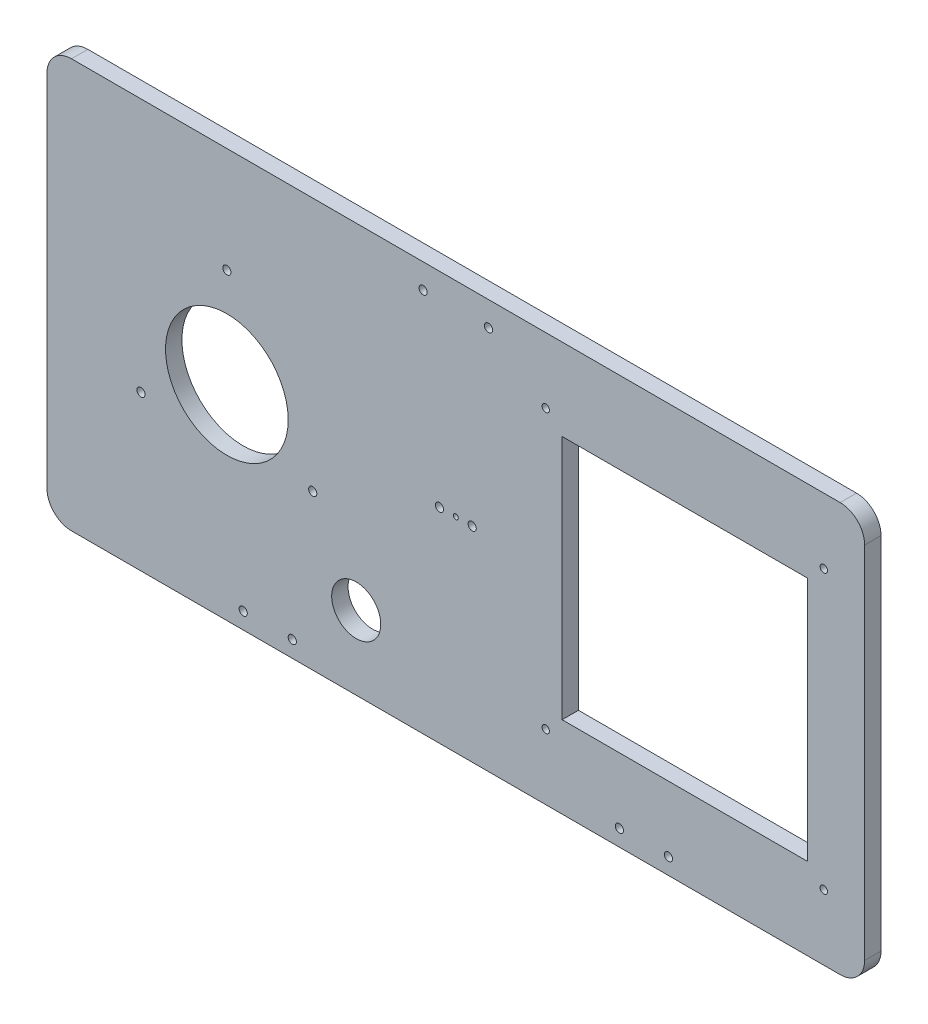
ISO-10303-21;
HEADER;
FILE_DESCRIPTION(('STEP AP214'),'2;1');
FILE_NAME('part.step','',(''),(''),'','','');
FILE_SCHEMA(('AUTOMOTIVE_DESIGN { 1 0 10303 214 1 1 1 1 }'));
ENDSEC;
DATA;
#1=APPLICATION_CONTEXT('core data for automotive mechanical design processes');
#2=APPLICATION_PROTOCOL_DEFINITION('international standard','automotive_design',2000,#1);
#3=PRODUCT_CONTEXT('',#1,'mechanical');
#4=PRODUCT('Part','Part','',(#3));
#5=PRODUCT_RELATED_PRODUCT_CATEGORY('part','',(#4));
#6=PRODUCT_DEFINITION_FORMATION('','',#4);
#7=PRODUCT_DEFINITION_CONTEXT('part definition',#1,'design');
#8=PRODUCT_DEFINITION('design','',#6,#7);
#9=PRODUCT_DEFINITION_SHAPE('','',#8);
#10=(LENGTH_UNIT() NAMED_UNIT(*) SI_UNIT(.MILLI.,.METRE.));
#11=(NAMED_UNIT(*) PLANE_ANGLE_UNIT() SI_UNIT($,.RADIAN.));
#12=(NAMED_UNIT(*) SI_UNIT($,.STERADIAN.) SOLID_ANGLE_UNIT());
#13=UNCERTAINTY_MEASURE_WITH_UNIT(LENGTH_MEASURE(1.E-05),#10,'distance_accuracy_value','');
#14=(GEOMETRIC_REPRESENTATION_CONTEXT(3) GLOBAL_UNCERTAINTY_ASSIGNED_CONTEXT((#13)) GLOBAL_UNIT_ASSIGNED_CONTEXT((#10,
#11,#12)) REPRESENTATION_CONTEXT('',''));
#15=CARTESIAN_POINT('',(0.,0.,0.));
#16=DIRECTION('',(0.,0.,1.));
#17=DIRECTION('',(1.,0.,0.));
#18=AXIS2_PLACEMENT_3D('',#15,#16,#17);
#19=CARTESIAN_POINT('',(485.,235.,10.));
#20=DIRECTION('',(0.,0.,-1.));
#21=DIRECTION('',(-1.,0.,0.));
#22=AXIS2_PLACEMENT_3D('',#19,#20,#21);
#23=PLANE('',#22);
#24=CARTESIAN_POINT('',(485.,235.,10.));
#25=DIRECTION('',(0.,0.,1.));
#26=DIRECTION('',(-1.,0.,0.));
#27=AXIS2_PLACEMENT_3D('',#24,#25,#26);
#28=CIRCLE('',#27,15.);
#29=CARTESIAN_POINT('',(500.,235.,10.));
#30=VERTEX_POINT('',#29);
#31=CARTESIAN_POINT('',(485.,250.,10.));
#32=VERTEX_POINT('',#31);
#33=EDGE_CURVE('E160',#30,#32,#28,.T.);
#34=ORIENTED_EDGE('',*,*,#33,.T.);
#35=DIRECTION('',(-1.,0.,0.));
#36=VECTOR('',#35,1.);
#37=CARTESIAN_POINT('',(15.,250.,10.));
#38=LINE('',#37,#36);
#39=CARTESIAN_POINT('',(15.,250.,10.));
#40=VERTEX_POINT('',#39);
#41=EDGE_CURVE('E163',#32,#40,#38,.T.);
#42=ORIENTED_EDGE('',*,*,#41,.T.);
#43=CARTESIAN_POINT('',(15.,235.,10.));
#44=DIRECTION('',(0.,0.,1.));
#45=DIRECTION('',(-1.,0.,0.));
#46=AXIS2_PLACEMENT_3D('',#43,#44,#45);
#47=CIRCLE('',#46,15.);
#48=CARTESIAN_POINT('',(0.,235.,10.));
#49=VERTEX_POINT('',#48);
#50=EDGE_CURVE('E166',#40,#49,#47,.T.);
#51=ORIENTED_EDGE('',*,*,#50,.T.);
#52=DIRECTION('',(0.,-1.,0.));
#53=VECTOR('',#52,1.);
#54=CARTESIAN_POINT('',(0.,15.0000000000001,10.));
#55=LINE('',#54,#53);
#56=CARTESIAN_POINT('',(0.,15.0000000000001,10.));
#57=VERTEX_POINT('',#56);
#58=EDGE_CURVE('E168',#49,#57,#55,.T.);
#59=ORIENTED_EDGE('',*,*,#58,.T.);
#60=CARTESIAN_POINT('',(15.,15.,10.));
#61=DIRECTION('',(0.,0.,1.));
#62=DIRECTION('',(-1.,0.,0.));
#63=AXIS2_PLACEMENT_3D('',#60,#61,#62);
#64=CIRCLE('',#63,15.);
#65=CARTESIAN_POINT('',(15.0000000000001,0.,10.));
#66=VERTEX_POINT('',#65);
#67=EDGE_CURVE('E170',#57,#66,#64,.T.);
#68=ORIENTED_EDGE('',*,*,#67,.T.);
#69=DIRECTION('',(1.,0.,0.));
#70=VECTOR('',#69,1.);
#71=CARTESIAN_POINT('',(15.0000000000001,0.,10.));
#72=LINE('',#71,#70);
#73=CARTESIAN_POINT('',(485.,0.,10.));
#74=VERTEX_POINT('',#73);
#75=EDGE_CURVE('E172',#66,#74,#72,.T.);
#76=ORIENTED_EDGE('',*,*,#75,.T.);
#77=CARTESIAN_POINT('',(485.,15.,10.));
#78=DIRECTION('',(0.,0.,1.));
#79=DIRECTION('',(1.,0.,0.));
#80=AXIS2_PLACEMENT_3D('',#77,#78,#79);
#81=CIRCLE('',#80,15.);
#82=CARTESIAN_POINT('',(500.,15.,10.));
#83=VERTEX_POINT('',#82);
#84=EDGE_CURVE('E174',#74,#83,#81,.T.);
#85=ORIENTED_EDGE('',*,*,#84,.T.);
#86=DIRECTION('',(0.,1.,0.));
#87=VECTOR('',#86,1.);
#88=CARTESIAN_POINT('',(500.,15.,10.));
#89=LINE('',#88,#87);
#90=EDGE_CURVE('E176',#83,#30,#89,.T.);
#91=ORIENTED_EDGE('',*,*,#90,.T.);
#92=EDGE_LOOP('',(#34,#42,#51,#59,#68,#76,#85,#91));
#93=FACE_BOUND('',#92,.T.);
#94=DIRECTION('',(0.,-1.,0.));
#95=VECTOR('',#94,1.);
#96=CARTESIAN_POINT('',(315.,50.,10.));
#97=LINE('',#96,#95);
#98=CARTESIAN_POINT('',(315.,200.,10.));
#99=VERTEX_POINT('',#98);
#100=CARTESIAN_POINT('',(315.,50.,10.));
#101=VERTEX_POINT('',#100);
#102=EDGE_CURVE('E121',#99,#101,#97,.T.);
#103=ORIENTED_EDGE('',*,*,#102,.F.);
#104=DIRECTION('',(-1.,0.,0.));
#105=VECTOR('',#104,1.);
#106=CARTESIAN_POINT('',(315.,200.,10.));
#107=LINE('',#106,#105);
#108=CARTESIAN_POINT('',(465.,200.,10.));
#109=VERTEX_POINT('',#108);
#110=EDGE_CURVE('E144',#109,#99,#107,.T.);
#111=ORIENTED_EDGE('',*,*,#110,.F.);
#112=DIRECTION('',(0.,1.,0.));
#113=VECTOR('',#112,1.);
#114=CARTESIAN_POINT('',(465.,50.,10.));
#115=LINE('',#114,#113);
#116=CARTESIAN_POINT('',(465.,50.,10.));
#117=VERTEX_POINT('',#116);
#118=EDGE_CURVE('E142',#117,#109,#115,.T.);
#119=ORIENTED_EDGE('',*,*,#118,.F.);
#120=DIRECTION('',(1.,0.,0.));
#121=VECTOR('',#120,1.);
#122=CARTESIAN_POINT('',(315.,50.,10.));
#123=LINE('',#122,#121);
#124=EDGE_CURVE('E129',#101,#117,#123,.T.);
#125=ORIENTED_EDGE('',*,*,#124,.F.);
#126=EDGE_LOOP('',(#103,#111,#119,#125));
#127=FACE_BOUND('',#126,.T.);
#128=CARTESIAN_POINT('',(110.,185.621778264911,10.));
#129=DIRECTION('',(0.,0.,1.));
#130=DIRECTION('',(1.,0.,0.));
#131=AXIS2_PLACEMENT_3D('',#128,#129,#130);
#132=CIRCLE('',#131,2.50000000000001);
#133=CARTESIAN_POINT('',(112.5,185.621778264911,10.));
#134=VERTEX_POINT('',#133);
#135=EDGE_CURVE('E150',#134,#134,#132,.T.);
#136=ORIENTED_EDGE('',*,*,#135,.F.);
#137=EDGE_LOOP('',(#136));
#138=FACE_BOUND('',#137,.T.);
#139=CARTESIAN_POINT('',(57.5000000000001,94.6891108675446,10.));
#140=DIRECTION('',(0.,0.,1.));
#141=DIRECTION('',(1.,0.,0.));
#142=AXIS2_PLACEMENT_3D('',#139,#140,#141);
#143=CIRCLE('',#142,2.5);
#144=CARTESIAN_POINT('',(60.0000000000001,94.6891108675446,10.));
#145=VERTEX_POINT('',#144);
#146=EDGE_CURVE('E462',#145,#145,#143,.T.);
#147=ORIENTED_EDGE('',*,*,#146,.F.);
#148=EDGE_LOOP('',(#147));
#149=FACE_BOUND('',#148,.T.);
#150=CARTESIAN_POINT('',(162.5,94.6891108675446,10.));
#151=DIRECTION('',(0.,0.,1.));
#152=DIRECTION('',(1.,0.,0.));
#153=AXIS2_PLACEMENT_3D('',#150,#151,#152);
#154=CIRCLE('',#153,2.5);
#155=CARTESIAN_POINT('',(165.,94.6891108675446,10.));
#156=VERTEX_POINT('',#155);
#157=EDGE_CURVE('E456',#156,#156,#154,.T.);
#158=ORIENTED_EDGE('',*,*,#157,.F.);
#159=EDGE_LOOP('',(#158));
#160=FACE_BOUND('',#159,.T.);
#161=CARTESIAN_POINT('',(110.,125.,10.));
#162=DIRECTION('',(0.,0.,1.));
#163=DIRECTION('',(1.,0.,0.));
#164=AXIS2_PLACEMENT_3D('',#161,#162,#163);
#165=CIRCLE('',#164,37.5);
#166=CARTESIAN_POINT('',(147.5,125.,10.));
#167=VERTEX_POINT('',#166);
#168=EDGE_CURVE('E450',#167,#167,#165,.T.);
#169=ORIENTED_EDGE('',*,*,#168,.F.);
#170=EDGE_LOOP('',(#169));
#171=FACE_BOUND('',#170,.T.);
#172=CARTESIAN_POINT('',(350.,10.,10.));
#173=DIRECTION('',(0.,0.,1.));
#174=DIRECTION('',(1.,0.,0.));
#175=AXIS2_PLACEMENT_3D('',#172,#173,#174);
#176=CIRCLE('',#175,2.50000000000002);
#177=CARTESIAN_POINT('',(352.5,10.,10.));
#178=VERTEX_POINT('',#177);
#179=EDGE_CURVE('E444',#178,#178,#176,.T.);
#180=ORIENTED_EDGE('',*,*,#179,.F.);
#181=EDGE_LOOP('',(#180));
#182=FACE_BOUND('',#181,.T.);
#183=CARTESIAN_POINT('',(380.,10.,10.));
#184=DIRECTION('',(0.,0.,1.));
#185=DIRECTION('',(1.,0.,0.));
#186=AXIS2_PLACEMENT_3D('',#183,#184,#185);
#187=CIRCLE('',#186,2.50000000000002);
#188=CARTESIAN_POINT('',(382.5,10.,10.));
#189=VERTEX_POINT('',#188);
#190=EDGE_CURVE('E438',#189,#189,#187,.T.);
#191=ORIENTED_EDGE('',*,*,#190,.F.);
#192=EDGE_LOOP('',(#191));
#193=FACE_BOUND('',#192,.T.);
#194=CARTESIAN_POINT('',(120.,10.,10.));
#195=DIRECTION('',(0.,0.,1.));
#196=DIRECTION('',(-1.,0.,0.));
#197=AXIS2_PLACEMENT_3D('',#194,#195,#196);
#198=CIRCLE('',#197,2.5);
#199=CARTESIAN_POINT('',(117.5,10.,10.));
#200=VERTEX_POINT('',#199);
#201=EDGE_CURVE('E432',#200,#200,#198,.T.);
#202=ORIENTED_EDGE('',*,*,#201,.F.);
#203=EDGE_LOOP('',(#202));
#204=FACE_BOUND('',#203,.T.);
#205=CARTESIAN_POINT('',(150.,10.,10.));
#206=DIRECTION('',(0.,0.,1.));
#207=DIRECTION('',(-1.,0.,0.));
#208=AXIS2_PLACEMENT_3D('',#205,#206,#207);
#209=CIRCLE('',#208,2.5);
#210=CARTESIAN_POINT('',(147.5,10.,10.));
#211=VERTEX_POINT('',#210);
#212=EDGE_CURVE('E426',#211,#211,#209,.T.);
#213=ORIENTED_EDGE('',*,*,#212,.F.);
#214=EDGE_LOOP('',(#213));
#215=FACE_BOUND('',#214,.T.);
#216=CARTESIAN_POINT('',(230.,235.,10.));
#217=DIRECTION('',(0.,0.,1.));
#218=DIRECTION('',(1.,0.,0.));
#219=AXIS2_PLACEMENT_3D('',#216,#217,#218);
#220=CIRCLE('',#219,2.5);
#221=CARTESIAN_POINT('',(232.5,235.,10.));
#222=VERTEX_POINT('',#221);
#223=EDGE_CURVE('E420',#222,#222,#220,.T.);
#224=ORIENTED_EDGE('',*,*,#223,.F.);
#225=EDGE_LOOP('',(#224));
#226=FACE_BOUND('',#225,.T.);
#227=CARTESIAN_POINT('',(270.,235.,10.));
#228=DIRECTION('',(0.,0.,1.));
#229=DIRECTION('',(1.,0.,0.));
#230=AXIS2_PLACEMENT_3D('',#227,#228,#229);
#231=CIRCLE('',#230,2.50000000000002);
#232=CARTESIAN_POINT('',(272.5,235.,10.));
#233=VERTEX_POINT('',#232);
#234=EDGE_CURVE('E414',#233,#233,#231,.T.);
#235=ORIENTED_EDGE('',*,*,#234,.F.);
#236=EDGE_LOOP('',(#235));
#237=FACE_BOUND('',#236,.T.);
#238=CARTESIAN_POINT('',(189.096460097782,45.,10.));
#239=DIRECTION('',(0.,0.,1.));
#240=DIRECTION('',(1.,0.,0.));
#241=AXIS2_PLACEMENT_3D('',#238,#239,#240);
#242=CIRCLE('',#241,15.);
#243=CARTESIAN_POINT('',(204.096460097782,45.,10.));
#244=VERTEX_POINT('',#243);
#245=EDGE_CURVE('E408',#244,#244,#242,.T.);
#246=ORIENTED_EDGE('',*,*,#245,.F.);
#247=EDGE_LOOP('',(#246));
#248=FACE_BOUND('',#247,.T.);
#249=CARTESIAN_POINT('',(475.,210.,10.));
#250=DIRECTION('',(0.,0.,1.));
#251=DIRECTION('',(1.,0.,0.));
#252=AXIS2_PLACEMENT_3D('',#249,#250,#251);
#253=CIRCLE('',#252,2.24999999999996);
#254=CARTESIAN_POINT('',(477.25,210.,10.));
#255=VERTEX_POINT('',#254);
#256=EDGE_CURVE('E402',#255,#255,#253,.T.);
#257=ORIENTED_EDGE('',*,*,#256,.F.);
#258=EDGE_LOOP('',(#257));
#259=FACE_BOUND('',#258,.T.);
#260=CARTESIAN_POINT('',(305.,210.,10.));
#261=DIRECTION('',(0.,0.,1.));
#262=DIRECTION('',(1.,0.,0.));
#263=AXIS2_PLACEMENT_3D('',#260,#261,#262);
#264=CIRCLE('',#263,2.24999999999996);
#265=CARTESIAN_POINT('',(307.25,210.,10.));
#266=VERTEX_POINT('',#265);
#267=EDGE_CURVE('E396',#266,#266,#264,.T.);
#268=ORIENTED_EDGE('',*,*,#267,.F.);
#269=EDGE_LOOP('',(#268));
#270=FACE_BOUND('',#269,.T.);
#271=CARTESIAN_POINT('',(305.,40.,10.));
#272=DIRECTION('',(0.,0.,1.));
#273=DIRECTION('',(1.,0.,0.));
#274=AXIS2_PLACEMENT_3D('',#271,#272,#273);
#275=CIRCLE('',#274,2.24999999999995);
#276=CARTESIAN_POINT('',(307.25,40.,10.));
#277=VERTEX_POINT('',#276);
#278=EDGE_CURVE('E390',#277,#277,#275,.T.);
#279=ORIENTED_EDGE('',*,*,#278,.F.);
#280=EDGE_LOOP('',(#279));
#281=FACE_BOUND('',#280,.T.);
#282=CARTESIAN_POINT('',(475.,40.,10.));
#283=DIRECTION('',(0.,0.,1.));
#284=DIRECTION('',(1.,0.,0.));
#285=AXIS2_PLACEMENT_3D('',#282,#283,#284);
#286=CIRCLE('',#285,2.24999999999995);
#287=CARTESIAN_POINT('',(477.25,40.,10.));
#288=VERTEX_POINT('',#287);
#289=EDGE_CURVE('E384',#288,#288,#286,.T.);
#290=ORIENTED_EDGE('',*,*,#289,.F.);
#291=EDGE_LOOP('',(#290));
#292=FACE_BOUND('',#291,.T.);
#293=CARTESIAN_POINT('',(240.,125.,10.));
#294=DIRECTION('',(0.,0.,1.));
#295=DIRECTION('',(1.,0.,0.));
#296=AXIS2_PLACEMENT_3D('',#293,#294,#295);
#297=CIRCLE('',#296,2.5);
#298=CARTESIAN_POINT('',(242.5,125.,10.));
#299=VERTEX_POINT('',#298);
#300=EDGE_CURVE('E378',#299,#299,#297,.T.);
#301=ORIENTED_EDGE('',*,*,#300,.F.);
#302=EDGE_LOOP('',(#301));
#303=FACE_BOUND('',#302,.T.);
#304=CARTESIAN_POINT('',(260.,125.,10.));
#305=DIRECTION('',(0.,0.,1.));
#306=DIRECTION('',(1.,0.,0.));
#307=AXIS2_PLACEMENT_3D('',#304,#305,#306);
#308=CIRCLE('',#307,2.50000000000002);
#309=CARTESIAN_POINT('',(262.5,125.,10.));
#310=VERTEX_POINT('',#309);
#311=EDGE_CURVE('E372',#310,#310,#308,.T.);
#312=ORIENTED_EDGE('',*,*,#311,.F.);
#313=EDGE_LOOP('',(#312));
#314=FACE_BOUND('',#313,.T.);
#315=CARTESIAN_POINT('',(250.,125.,10.));
#316=DIRECTION('',(0.,0.,1.));
#317=DIRECTION('',(1.,0.,0.));
#318=AXIS2_PLACEMENT_3D('',#315,#316,#317);
#319=CIRCLE('',#318,1.50000000000002);
#320=CARTESIAN_POINT('',(251.5,125.,10.));
#321=VERTEX_POINT('',#320);
#322=EDGE_CURVE('E363',#321,#321,#319,.T.);
#323=ORIENTED_EDGE('',*,*,#322,.F.);
#324=EDGE_LOOP('',(#323));
#325=FACE_BOUND('',#324,.T.);
#326=ADVANCED_FACE('F32',(#93,#127,#138,#149,#160,#171,#182,#193,#204,#215,#226,#237,#248,#259,
#270,#281,#292,#303,#314,#325),#23,.F.);
#327=CARTESIAN_POINT('',(485.,235.,0.));
#328=DIRECTION('',(0.,0.,-1.));
#329=DIRECTION('',(-1.,0.,0.));
#330=AXIS2_PLACEMENT_3D('',#327,#328,#329);
#331=PLANE('',#330);
#332=CARTESIAN_POINT('',(260.,125.,0.));
#333=DIRECTION('',(0.,0.,1.));
#334=DIRECTION('',(1.,0.,0.));
#335=AXIS2_PLACEMENT_3D('',#332,#333,#334);
#336=CIRCLE('',#335,2.50000000000002);
#337=CARTESIAN_POINT('',(262.5,125.,0.));
#338=VERTEX_POINT('',#337);
#339=EDGE_CURVE('E369',#338,#338,#336,.T.);
#340=ORIENTED_EDGE('',*,*,#339,.T.);
#341=EDGE_LOOP('',(#340));
#342=FACE_BOUND('',#341,.T.);
#343=CARTESIAN_POINT('',(475.,40.,0.));
#344=DIRECTION('',(0.,0.,1.));
#345=DIRECTION('',(1.,0.,0.));
#346=AXIS2_PLACEMENT_3D('',#343,#344,#345);
#347=CIRCLE('',#346,2.24999999999995);
#348=CARTESIAN_POINT('',(477.25,40.,0.));
#349=VERTEX_POINT('',#348);
#350=EDGE_CURVE('E381',#349,#349,#347,.T.);
#351=ORIENTED_EDGE('',*,*,#350,.T.);
#352=EDGE_LOOP('',(#351));
#353=FACE_BOUND('',#352,.T.);
#354=CARTESIAN_POINT('',(305.,210.,0.));
#355=DIRECTION('',(0.,0.,1.));
#356=DIRECTION('',(1.,0.,0.));
#357=AXIS2_PLACEMENT_3D('',#354,#355,#356);
#358=CIRCLE('',#357,2.24999999999996);
#359=CARTESIAN_POINT('',(307.25,210.,0.));
#360=VERTEX_POINT('',#359);
#361=EDGE_CURVE('E393',#360,#360,#358,.T.);
#362=ORIENTED_EDGE('',*,*,#361,.T.);
#363=EDGE_LOOP('',(#362));
#364=FACE_BOUND('',#363,.T.);
#365=CARTESIAN_POINT('',(189.096460097782,45.,0.));
#366=DIRECTION('',(0.,0.,1.));
#367=DIRECTION('',(1.,0.,0.));
#368=AXIS2_PLACEMENT_3D('',#365,#366,#367);
#369=CIRCLE('',#368,15.);
#370=CARTESIAN_POINT('',(204.096460097782,45.,0.));
#371=VERTEX_POINT('',#370);
#372=EDGE_CURVE('E405',#371,#371,#369,.T.);
#373=ORIENTED_EDGE('',*,*,#372,.T.);
#374=EDGE_LOOP('',(#373));
#375=FACE_BOUND('',#374,.T.);
#376=CARTESIAN_POINT('',(230.,235.,0.));
#377=DIRECTION('',(0.,0.,1.));
#378=DIRECTION('',(1.,0.,0.));
#379=AXIS2_PLACEMENT_3D('',#376,#377,#378);
#380=CIRCLE('',#379,2.5);
#381=CARTESIAN_POINT('',(232.5,235.,0.));
#382=VERTEX_POINT('',#381);
#383=EDGE_CURVE('E417',#382,#382,#380,.T.);
#384=ORIENTED_EDGE('',*,*,#383,.T.);
#385=EDGE_LOOP('',(#384));
#386=FACE_BOUND('',#385,.T.);
#387=CARTESIAN_POINT('',(120.,10.,0.));
#388=DIRECTION('',(0.,0.,1.));
#389=DIRECTION('',(-1.,0.,0.));
#390=AXIS2_PLACEMENT_3D('',#387,#388,#389);
#391=CIRCLE('',#390,2.5);
#392=CARTESIAN_POINT('',(117.5,10.,0.));
#393=VERTEX_POINT('',#392);
#394=EDGE_CURVE('E429',#393,#393,#391,.T.);
#395=ORIENTED_EDGE('',*,*,#394,.T.);
#396=EDGE_LOOP('',(#395));
#397=FACE_BOUND('',#396,.T.);
#398=CARTESIAN_POINT('',(350.,10.,0.));
#399=DIRECTION('',(0.,0.,1.));
#400=DIRECTION('',(1.,0.,0.));
#401=AXIS2_PLACEMENT_3D('',#398,#399,#400);
#402=CIRCLE('',#401,2.50000000000002);
#403=CARTESIAN_POINT('',(352.5,10.,0.));
#404=VERTEX_POINT('',#403);
#405=EDGE_CURVE('E441',#404,#404,#402,.T.);
#406=ORIENTED_EDGE('',*,*,#405,.T.);
#407=EDGE_LOOP('',(#406));
#408=FACE_BOUND('',#407,.T.);
#409=CARTESIAN_POINT('',(162.5,94.6891108675446,0.));
#410=DIRECTION('',(0.,0.,1.));
#411=DIRECTION('',(1.,0.,0.));
#412=AXIS2_PLACEMENT_3D('',#409,#410,#411);
#413=CIRCLE('',#412,2.5);
#414=CARTESIAN_POINT('',(165.,94.6891108675446,0.));
#415=VERTEX_POINT('',#414);
#416=EDGE_CURVE('E453',#415,#415,#413,.T.);
#417=ORIENTED_EDGE('',*,*,#416,.T.);
#418=EDGE_LOOP('',(#417));
#419=FACE_BOUND('',#418,.T.);
#420=CARTESIAN_POINT('',(110.,185.621778264911,0.));
#421=DIRECTION('',(0.,0.,1.));
#422=DIRECTION('',(1.,0.,0.));
#423=AXIS2_PLACEMENT_3D('',#420,#421,#422);
#424=CIRCLE('',#423,2.50000000000001);
#425=CARTESIAN_POINT('',(112.5,185.621778264911,0.));
#426=VERTEX_POINT('',#425);
#427=EDGE_CURVE('E465',#426,#426,#424,.T.);
#428=ORIENTED_EDGE('',*,*,#427,.T.);
#429=EDGE_LOOP('',(#428));
#430=FACE_BOUND('',#429,.T.);
#431=CARTESIAN_POINT('',(485.,235.,0.));
#432=DIRECTION('',(0.,0.,1.));
#433=DIRECTION('',(-1.,0.,0.));
#434=AXIS2_PLACEMENT_3D('',#431,#432,#433);
#435=CIRCLE('',#434,15.);
#436=CARTESIAN_POINT('',(500.,235.,0.));
#437=VERTEX_POINT('',#436);
#438=CARTESIAN_POINT('',(485.,250.,0.));
#439=VERTEX_POINT('',#438);
#440=EDGE_CURVE('E137',#437,#439,#435,.T.);
#441=ORIENTED_EDGE('',*,*,#440,.F.);
#442=DIRECTION('',(0.,1.,0.));
#443=VECTOR('',#442,1.);
#444=CARTESIAN_POINT('',(500.,15.,0.));
#445=LINE('',#444,#443);
#446=CARTESIAN_POINT('',(500.,15.,0.));
#447=VERTEX_POINT('',#446);
#448=EDGE_CURVE('E164',#447,#437,#445,.T.);
#449=ORIENTED_EDGE('',*,*,#448,.F.);
#450=CARTESIAN_POINT('',(485.,15.,0.));
#451=DIRECTION('',(0.,0.,1.));
#452=DIRECTION('',(1.,0.,0.));
#453=AXIS2_PLACEMENT_3D('',#450,#451,#452);
#454=CIRCLE('',#453,15.);
#455=CARTESIAN_POINT('',(485.,0.,0.));
#456=VERTEX_POINT('',#455);
#457=EDGE_CURVE('E191',#456,#447,#454,.T.);
#458=ORIENTED_EDGE('',*,*,#457,.F.);
#459=DIRECTION('',(1.,0.,0.));
#460=VECTOR('',#459,1.);
#461=CARTESIAN_POINT('',(15.0000000000001,0.,0.));
#462=LINE('',#461,#460);
#463=CARTESIAN_POINT('',(15.0000000000001,0.,0.));
#464=VERTEX_POINT('',#463);
#465=EDGE_CURVE('E189',#464,#456,#462,.T.);
#466=ORIENTED_EDGE('',*,*,#465,.F.);
#467=CARTESIAN_POINT('',(15.,15.,0.));
#468=DIRECTION('',(0.,0.,1.));
#469=DIRECTION('',(-1.,0.,0.));
#470=AXIS2_PLACEMENT_3D('',#467,#468,#469);
#471=CIRCLE('',#470,15.);
#472=CARTESIAN_POINT('',(0.,15.0000000000001,0.));
#473=VERTEX_POINT('',#472);
#474=EDGE_CURVE('E187',#473,#464,#471,.T.);
#475=ORIENTED_EDGE('',*,*,#474,.F.);
#476=DIRECTION('',(0.,-1.,0.));
#477=VECTOR('',#476,1.);
#478=CARTESIAN_POINT('',(0.,15.0000000000001,0.));
#479=LINE('',#478,#477);
#480=CARTESIAN_POINT('',(0.,235.,0.));
#481=VERTEX_POINT('',#480);
#482=EDGE_CURVE('E185',#481,#473,#479,.T.);
#483=ORIENTED_EDGE('',*,*,#482,.F.);
#484=CARTESIAN_POINT('',(15.,235.,0.));
#485=DIRECTION('',(0.,0.,1.));
#486=DIRECTION('',(-1.,0.,0.));
#487=AXIS2_PLACEMENT_3D('',#484,#485,#486);
#488=CIRCLE('',#487,15.);
#489=CARTESIAN_POINT('',(15.,250.,0.));
#490=VERTEX_POINT('',#489);
#491=EDGE_CURVE('E183',#490,#481,#488,.T.);
#492=ORIENTED_EDGE('',*,*,#491,.F.);
#493=DIRECTION('',(-1.,0.,0.));
#494=VECTOR('',#493,1.);
#495=CARTESIAN_POINT('',(15.,250.,0.));
#496=LINE('',#495,#494);
#497=EDGE_CURVE('E181',#439,#490,#496,.T.);
#498=ORIENTED_EDGE('',*,*,#497,.F.);
#499=EDGE_LOOP('',(#441,#449,#458,#466,#475,#483,#492,#498));
#500=FACE_BOUND('',#499,.T.);
#501=DIRECTION('',(-1.,0.,0.));
#502=VECTOR('',#501,1.);
#503=CARTESIAN_POINT('',(315.,200.,0.));
#504=LINE('',#503,#502);
#505=CARTESIAN_POINT('',(465.,200.,0.));
#506=VERTEX_POINT('',#505);
#507=CARTESIAN_POINT('',(315.,200.,0.));
#508=VERTEX_POINT('',#507);
#509=EDGE_CURVE('E130',#506,#508,#504,.T.);
#510=ORIENTED_EDGE('',*,*,#509,.T.);
#511=DIRECTION('',(0.,-1.,0.));
#512=VECTOR('',#511,1.);
#513=CARTESIAN_POINT('',(315.,50.,0.));
#514=LINE('',#513,#512);
#515=CARTESIAN_POINT('',(315.,50.,0.));
#516=VERTEX_POINT('',#515);
#517=EDGE_CURVE('E55',#508,#516,#514,.T.);
#518=ORIENTED_EDGE('',*,*,#517,.T.);
#519=DIRECTION('',(1.,0.,0.));
#520=VECTOR('',#519,1.);
#521=CARTESIAN_POINT('',(315.,50.,0.));
#522=LINE('',#521,#520);
#523=CARTESIAN_POINT('',(465.,50.,0.));
#524=VERTEX_POINT('',#523);
#525=EDGE_CURVE('E136',#516,#524,#522,.T.);
#526=ORIENTED_EDGE('',*,*,#525,.T.);
#527=DIRECTION('',(0.,1.,0.));
#528=VECTOR('',#527,1.);
#529=CARTESIAN_POINT('',(465.,50.,0.));
#530=LINE('',#529,#528);
#531=EDGE_CURVE('E152',#524,#506,#530,.T.);
#532=ORIENTED_EDGE('',*,*,#531,.T.);
#533=EDGE_LOOP('',(#510,#518,#526,#532));
#534=FACE_BOUND('',#533,.T.);
#535=CARTESIAN_POINT('',(57.5000000000001,94.6891108675446,0.));
#536=DIRECTION('',(0.,0.,1.));
#537=DIRECTION('',(1.,0.,0.));
#538=AXIS2_PLACEMENT_3D('',#535,#536,#537);
#539=CIRCLE('',#538,2.5);
#540=CARTESIAN_POINT('',(60.0000000000001,94.6891108675446,0.));
#541=VERTEX_POINT('',#540);
#542=EDGE_CURVE('E459',#541,#541,#539,.T.);
#543=ORIENTED_EDGE('',*,*,#542,.T.);
#544=EDGE_LOOP('',(#543));
#545=FACE_BOUND('',#544,.T.);
#546=CARTESIAN_POINT('',(110.,125.,0.));
#547=DIRECTION('',(0.,0.,1.));
#548=DIRECTION('',(1.,0.,0.));
#549=AXIS2_PLACEMENT_3D('',#546,#547,#548);
#550=CIRCLE('',#549,37.5);
#551=CARTESIAN_POINT('',(147.5,125.,0.));
#552=VERTEX_POINT('',#551);
#553=EDGE_CURVE('E447',#552,#552,#550,.T.);
#554=ORIENTED_EDGE('',*,*,#553,.T.);
#555=EDGE_LOOP('',(#554));
#556=FACE_BOUND('',#555,.T.);
#557=CARTESIAN_POINT('',(380.,10.,0.));
#558=DIRECTION('',(0.,0.,1.));
#559=DIRECTION('',(1.,0.,0.));
#560=AXIS2_PLACEMENT_3D('',#557,#558,#559);
#561=CIRCLE('',#560,2.50000000000002);
#562=CARTESIAN_POINT('',(382.5,10.,0.));
#563=VERTEX_POINT('',#562);
#564=EDGE_CURVE('E435',#563,#563,#561,.T.);
#565=ORIENTED_EDGE('',*,*,#564,.T.);
#566=EDGE_LOOP('',(#565));
#567=FACE_BOUND('',#566,.T.);
#568=CARTESIAN_POINT('',(150.,10.,0.));
#569=DIRECTION('',(0.,0.,1.));
#570=DIRECTION('',(-1.,0.,0.));
#571=AXIS2_PLACEMENT_3D('',#568,#569,#570);
#572=CIRCLE('',#571,2.5);
#573=CARTESIAN_POINT('',(147.5,10.,0.));
#574=VERTEX_POINT('',#573);
#575=EDGE_CURVE('E423',#574,#574,#572,.T.);
#576=ORIENTED_EDGE('',*,*,#575,.T.);
#577=EDGE_LOOP('',(#576));
#578=FACE_BOUND('',#577,.T.);
#579=CARTESIAN_POINT('',(270.,235.,0.));
#580=DIRECTION('',(0.,0.,1.));
#581=DIRECTION('',(1.,0.,0.));
#582=AXIS2_PLACEMENT_3D('',#579,#580,#581);
#583=CIRCLE('',#582,2.50000000000002);
#584=CARTESIAN_POINT('',(272.5,235.,0.));
#585=VERTEX_POINT('',#584);
#586=EDGE_CURVE('E411',#585,#585,#583,.T.);
#587=ORIENTED_EDGE('',*,*,#586,.T.);
#588=EDGE_LOOP('',(#587));
#589=FACE_BOUND('',#588,.T.);
#590=CARTESIAN_POINT('',(475.,210.,0.));
#591=DIRECTION('',(0.,0.,1.));
#592=DIRECTION('',(1.,0.,0.));
#593=AXIS2_PLACEMENT_3D('',#590,#591,#592);
#594=CIRCLE('',#593,2.24999999999996);
#595=CARTESIAN_POINT('',(477.25,210.,0.));
#596=VERTEX_POINT('',#595);
#597=EDGE_CURVE('E399',#596,#596,#594,.T.);
#598=ORIENTED_EDGE('',*,*,#597,.T.);
#599=EDGE_LOOP('',(#598));
#600=FACE_BOUND('',#599,.T.);
#601=CARTESIAN_POINT('',(305.,40.,0.));
#602=DIRECTION('',(0.,0.,1.));
#603=DIRECTION('',(1.,0.,0.));
#604=AXIS2_PLACEMENT_3D('',#601,#602,#603);
#605=CIRCLE('',#604,2.24999999999995);
#606=CARTESIAN_POINT('',(307.25,40.,0.));
#607=VERTEX_POINT('',#606);
#608=EDGE_CURVE('E387',#607,#607,#605,.T.);
#609=ORIENTED_EDGE('',*,*,#608,.T.);
#610=EDGE_LOOP('',(#609));
#611=FACE_BOUND('',#610,.T.);
#612=CARTESIAN_POINT('',(240.,125.,0.));
#613=DIRECTION('',(0.,0.,1.));
#614=DIRECTION('',(1.,0.,0.));
#615=AXIS2_PLACEMENT_3D('',#612,#613,#614);
#616=CIRCLE('',#615,2.5);
#617=CARTESIAN_POINT('',(242.5,125.,0.));
#618=VERTEX_POINT('',#617);
#619=EDGE_CURVE('E375',#618,#618,#616,.T.);
#620=ORIENTED_EDGE('',*,*,#619,.T.);
#621=EDGE_LOOP('',(#620));
#622=FACE_BOUND('',#621,.T.);
#623=CARTESIAN_POINT('',(250.,125.,0.));
#624=DIRECTION('',(0.,0.,1.));
#625=DIRECTION('',(1.,0.,0.));
#626=AXIS2_PLACEMENT_3D('',#623,#624,#625);
#627=CIRCLE('',#626,1.50000000000002);
#628=CARTESIAN_POINT('',(251.5,125.,0.));
#629=VERTEX_POINT('',#628);
#630=EDGE_CURVE('E366',#629,#629,#627,.T.);
#631=ORIENTED_EDGE('',*,*,#630,.T.);
#632=EDGE_LOOP('',(#631));
#633=FACE_BOUND('',#632,.T.);
#634=ADVANCED_FACE('F221',(#342,#353,#364,#375,#386,#397,#408,#419,#430,#500,#534,#545,#556,
#567,#578,#589,#600,#611,#622,#633),#331,.T.);
#635=CARTESIAN_POINT('',(485.,235.,10.));
#636=DIRECTION('',(0.,0.,-1.));
#637=DIRECTION('',(-1.,0.,0.));
#638=AXIS2_PLACEMENT_3D('',#635,#636,#637);
#639=CYLINDRICAL_SURFACE('',#638,15.);
#640=ORIENTED_EDGE('',*,*,#440,.T.);
#641=DIRECTION('',(0.,0.,-1.));
#642=VECTOR('',#641,1.);
#643=CARTESIAN_POINT('',(485.,250.,10.));
#644=LINE('',#643,#642);
#645=EDGE_CURVE('E11',#32,#439,#644,.T.);
#646=ORIENTED_EDGE('',*,*,#645,.F.);
#647=ORIENTED_EDGE('',*,*,#33,.F.);
#648=DIRECTION('',(0.,0.,-1.));
#649=VECTOR('',#648,1.);
#650=CARTESIAN_POINT('',(500.,235.,10.));
#651=LINE('',#650,#649);
#652=EDGE_CURVE('E178',#30,#437,#651,.T.);
#653=ORIENTED_EDGE('',*,*,#652,.T.);
#654=EDGE_LOOP('',(#640,#646,#647,#653));
#655=FACE_BOUND('',#654,.T.);
#656=ADVANCED_FACE('F34',(#655),#639,.T.);
#657=CARTESIAN_POINT('',(15.,250.,10.));
#658=DIRECTION('',(0.,-1.,0.));
#659=DIRECTION('',(0.,0.,-1.));
#660=AXIS2_PLACEMENT_3D('',#657,#658,#659);
#661=PLANE('',#660);
#662=ORIENTED_EDGE('',*,*,#497,.T.);
#663=DIRECTION('',(0.,0.,-1.));
#664=VECTOR('',#663,1.);
#665=CARTESIAN_POINT('',(15.,250.,10.));
#666=LINE('',#665,#664);
#667=EDGE_CURVE('E40',#40,#490,#666,.T.);
#668=ORIENTED_EDGE('',*,*,#667,.F.);
#669=ORIENTED_EDGE('',*,*,#41,.F.);
#670=ORIENTED_EDGE('',*,*,#645,.T.);
#671=EDGE_LOOP('',(#662,#668,#669,#670));
#672=FACE_BOUND('',#671,.T.);
#673=ADVANCED_FACE('F238',(#672),#661,.F.);
#674=CARTESIAN_POINT('',(15.,235.,10.));
#675=DIRECTION('',(0.,0.,-1.));
#676=DIRECTION('',(-1.,0.,0.));
#677=AXIS2_PLACEMENT_3D('',#674,#675,#676);
#678=CYLINDRICAL_SURFACE('',#677,15.);
#679=ORIENTED_EDGE('',*,*,#491,.T.);
#680=DIRECTION('',(0.,0.,-1.));
#681=VECTOR('',#680,1.);
#682=CARTESIAN_POINT('',(0.,235.,10.));
#683=LINE('',#682,#681);
#684=EDGE_CURVE('E208',#49,#481,#683,.T.);
#685=ORIENTED_EDGE('',*,*,#684,.F.);
#686=ORIENTED_EDGE('',*,*,#50,.F.);
#687=ORIENTED_EDGE('',*,*,#667,.T.);
#688=EDGE_LOOP('',(#679,#685,#686,#687));
#689=FACE_BOUND('',#688,.T.);
#690=ADVANCED_FACE('F215',(#689),#678,.T.);
#691=CARTESIAN_POINT('',(0.,15.0000000000001,10.));
#692=DIRECTION('',(1.,0.,0.));
#693=DIRECTION('',(0.,0.,-1.));
#694=AXIS2_PLACEMENT_3D('',#691,#692,#693);
#695=PLANE('',#694);
#696=ORIENTED_EDGE('',*,*,#482,.T.);
#697=DIRECTION('',(0.,0.,-1.));
#698=VECTOR('',#697,1.);
#699=CARTESIAN_POINT('',(0.,15.0000000000001,10.));
#700=LINE('',#699,#698);
#701=EDGE_CURVE('E205',#57,#473,#700,.T.);
#702=ORIENTED_EDGE('',*,*,#701,.F.);
#703=ORIENTED_EDGE('',*,*,#58,.F.);
#704=ORIENTED_EDGE('',*,*,#684,.T.);
#705=EDGE_LOOP('',(#696,#702,#703,#704));
#706=FACE_BOUND('',#705,.T.);
#707=ADVANCED_FACE('F227',(#706),#695,.F.);
#708=CARTESIAN_POINT('',(15.,15.,10.));
#709=DIRECTION('',(0.,0.,-1.));
#710=DIRECTION('',(-1.,0.,0.));
#711=AXIS2_PLACEMENT_3D('',#708,#709,#710);
#712=CYLINDRICAL_SURFACE('',#711,15.);
#713=ORIENTED_EDGE('',*,*,#474,.T.);
#714=DIRECTION('',(0.,0.,-1.));
#715=VECTOR('',#714,1.);
#716=CARTESIAN_POINT('',(15.0000000000001,0.,10.));
#717=LINE('',#716,#715);
#718=EDGE_CURVE('E202',#66,#464,#717,.T.);
#719=ORIENTED_EDGE('',*,*,#718,.F.);
#720=ORIENTED_EDGE('',*,*,#67,.F.);
#721=ORIENTED_EDGE('',*,*,#701,.T.);
#722=EDGE_LOOP('',(#713,#719,#720,#721));
#723=FACE_BOUND('',#722,.T.);
#724=ADVANCED_FACE('F231',(#723),#712,.T.);
#725=CARTESIAN_POINT('',(15.0000000000001,0.,10.));
#726=DIRECTION('',(0.,1.,0.));
#727=DIRECTION('',(-1.,0.,0.));
#728=AXIS2_PLACEMENT_3D('',#725,#726,#727);
#729=PLANE('',#728);
#730=ORIENTED_EDGE('',*,*,#465,.T.);
#731=DIRECTION('',(0.,0.,-1.));
#732=VECTOR('',#731,1.);
#733=CARTESIAN_POINT('',(485.,0.,10.));
#734=LINE('',#733,#732);
#735=EDGE_CURVE('E199',#74,#456,#734,.T.);
#736=ORIENTED_EDGE('',*,*,#735,.F.);
#737=ORIENTED_EDGE('',*,*,#75,.F.);
#738=ORIENTED_EDGE('',*,*,#718,.T.);
#739=EDGE_LOOP('',(#730,#736,#737,#738));
#740=FACE_BOUND('',#739,.T.);
#741=ADVANCED_FACE('F251',(#740),#729,.F.);
#742=CARTESIAN_POINT('',(485.,15.,10.));
#743=DIRECTION('',(0.,0.,-1.));
#744=DIRECTION('',(-1.,0.,0.));
#745=AXIS2_PLACEMENT_3D('',#742,#743,#744);
#746=CYLINDRICAL_SURFACE('',#745,15.);
#747=ORIENTED_EDGE('',*,*,#457,.T.);
#748=DIRECTION('',(0.,0.,-1.));
#749=VECTOR('',#748,1.);
#750=CARTESIAN_POINT('',(500.,15.,10.));
#751=LINE('',#750,#749);
#752=EDGE_CURVE('E196',#83,#447,#751,.T.);
#753=ORIENTED_EDGE('',*,*,#752,.F.);
#754=ORIENTED_EDGE('',*,*,#84,.F.);
#755=ORIENTED_EDGE('',*,*,#735,.T.);
#756=EDGE_LOOP('',(#747,#753,#754,#755));
#757=FACE_BOUND('',#756,.T.);
#758=ADVANCED_FACE('F249',(#757),#746,.T.);
#759=CARTESIAN_POINT('',(500.,15.,10.));
#760=DIRECTION('',(-1.,0.,0.));
#761=DIRECTION('',(0.,0.,1.));
#762=AXIS2_PLACEMENT_3D('',#759,#760,#761);
#763=PLANE('',#762);
#764=ORIENTED_EDGE('',*,*,#448,.T.);
#765=ORIENTED_EDGE('',*,*,#652,.F.);
#766=ORIENTED_EDGE('',*,*,#90,.F.);
#767=ORIENTED_EDGE('',*,*,#752,.T.);
#768=EDGE_LOOP('',(#764,#765,#766,#767));
#769=FACE_BOUND('',#768,.T.);
#770=ADVANCED_FACE('F244',(#769),#763,.F.);
#771=CARTESIAN_POINT('',(315.,50.,10.));
#772=DIRECTION('',(1.,0.,0.));
#773=DIRECTION('',(0.,1.,0.));
#774=AXIS2_PLACEMENT_3D('',#771,#772,#773);
#775=PLANE('',#774);
#776=ORIENTED_EDGE('',*,*,#517,.F.);
#777=DIRECTION('',(0.,0.,-1.));
#778=VECTOR('',#777,1.);
#779=CARTESIAN_POINT('',(315.,200.,10.));
#780=LINE('',#779,#778);
#781=EDGE_CURVE('E125',#99,#508,#780,.T.);
#782=ORIENTED_EDGE('',*,*,#781,.F.);
#783=ORIENTED_EDGE('',*,*,#102,.T.);
#784=DIRECTION('',(0.,0.,-1.));
#785=VECTOR('',#784,1.);
#786=CARTESIAN_POINT('',(315.,50.,10.));
#787=LINE('',#786,#785);
#788=EDGE_CURVE('E124',#101,#516,#787,.T.);
#789=ORIENTED_EDGE('',*,*,#788,.T.);
#790=EDGE_LOOP('',(#776,#782,#783,#789));
#791=FACE_BOUND('',#790,.T.);
#792=ADVANCED_FACE('F123',(#791),#775,.T.);
#793=CARTESIAN_POINT('',(315.,50.,10.));
#794=DIRECTION('',(0.,1.,0.));
#795=DIRECTION('',(0.,0.,1.));
#796=AXIS2_PLACEMENT_3D('',#793,#794,#795);
#797=PLANE('',#796);
#798=ORIENTED_EDGE('',*,*,#525,.F.);
#799=ORIENTED_EDGE('',*,*,#788,.F.);
#800=ORIENTED_EDGE('',*,*,#124,.T.);
#801=DIRECTION('',(0.,0.,-1.));
#802=VECTOR('',#801,1.);
#803=CARTESIAN_POINT('',(465.,50.,10.));
#804=LINE('',#803,#802);
#805=EDGE_CURVE('E138',#117,#524,#804,.T.);
#806=ORIENTED_EDGE('',*,*,#805,.T.);
#807=EDGE_LOOP('',(#798,#799,#800,#806));
#808=FACE_BOUND('',#807,.T.);
#809=ADVANCED_FACE('F133',(#808),#797,.T.);
#810=CARTESIAN_POINT('',(465.,50.,10.));
#811=DIRECTION('',(-1.,0.,0.));
#812=DIRECTION('',(0.,-1.,0.));
#813=AXIS2_PLACEMENT_3D('',#810,#811,#812);
#814=PLANE('',#813);
#815=ORIENTED_EDGE('',*,*,#531,.F.);
#816=ORIENTED_EDGE('',*,*,#805,.F.);
#817=ORIENTED_EDGE('',*,*,#118,.T.);
#818=DIRECTION('',(0.,0.,-1.));
#819=VECTOR('',#818,1.);
#820=CARTESIAN_POINT('',(465.,200.,10.));
#821=LINE('',#820,#819);
#822=EDGE_CURVE('E47',#109,#506,#821,.T.);
#823=ORIENTED_EDGE('',*,*,#822,.T.);
#824=EDGE_LOOP('',(#815,#816,#817,#823));
#825=FACE_BOUND('',#824,.T.);
#826=ADVANCED_FACE('F277',(#825),#814,.T.);
#827=CARTESIAN_POINT('',(315.,200.,10.));
#828=DIRECTION('',(0.,-1.,0.));
#829=DIRECTION('',(0.,0.,-1.));
#830=AXIS2_PLACEMENT_3D('',#827,#828,#829);
#831=PLANE('',#830);
#832=ORIENTED_EDGE('',*,*,#509,.F.);
#833=ORIENTED_EDGE('',*,*,#822,.F.);
#834=ORIENTED_EDGE('',*,*,#110,.T.);
#835=ORIENTED_EDGE('',*,*,#781,.T.);
#836=EDGE_LOOP('',(#832,#833,#834,#835));
#837=FACE_BOUND('',#836,.T.);
#838=ADVANCED_FACE('F281',(#837),#831,.T.);
#839=CARTESIAN_POINT('',(110.,185.621778264911,10.));
#840=DIRECTION('',(0.,0.,-1.));
#841=DIRECTION('',(-1.,0.,0.));
#842=AXIS2_PLACEMENT_3D('',#839,#840,#841);
#843=CYLINDRICAL_SURFACE('',#842,2.50000000000001);
#844=ORIENTED_EDGE('',*,*,#135,.T.);
#845=EDGE_LOOP('',(#844));
#846=FACE_BOUND('',#845,.T.);
#847=ORIENTED_EDGE('',*,*,#427,.F.);
#848=EDGE_LOOP('',(#847));
#849=FACE_BOUND('',#848,.T.);
#850=ADVANCED_FACE('F287',(#846,#849),#843,.F.);
#851=CARTESIAN_POINT('',(57.5000000000001,94.6891108675446,10.));
#852=DIRECTION('',(0.,0.,-1.));
#853=DIRECTION('',(-1.,0.,0.));
#854=AXIS2_PLACEMENT_3D('',#851,#852,#853);
#855=CYLINDRICAL_SURFACE('',#854,2.5);
#856=ORIENTED_EDGE('',*,*,#146,.T.);
#857=EDGE_LOOP('',(#856));
#858=FACE_BOUND('',#857,.T.);
#859=ORIENTED_EDGE('',*,*,#542,.F.);
#860=EDGE_LOOP('',(#859));
#861=FACE_BOUND('',#860,.T.);
#862=ADVANCED_FACE('F290',(#858,#861),#855,.F.);
#863=CARTESIAN_POINT('',(162.5,94.6891108675446,10.));
#864=DIRECTION('',(0.,0.,-1.));
#865=DIRECTION('',(-1.,0.,0.));
#866=AXIS2_PLACEMENT_3D('',#863,#864,#865);
#867=CYLINDRICAL_SURFACE('',#866,2.5);
#868=ORIENTED_EDGE('',*,*,#157,.T.);
#869=EDGE_LOOP('',(#868));
#870=FACE_BOUND('',#869,.T.);
#871=ORIENTED_EDGE('',*,*,#416,.F.);
#872=EDGE_LOOP('',(#871));
#873=FACE_BOUND('',#872,.T.);
#874=ADVANCED_FACE('F294',(#870,#873),#867,.F.);
#875=CARTESIAN_POINT('',(110.,125.,10.));
#876=DIRECTION('',(0.,0.,-1.));
#877=DIRECTION('',(-1.,0.,0.));
#878=AXIS2_PLACEMENT_3D('',#875,#876,#877);
#879=CYLINDRICAL_SURFACE('',#878,37.5);
#880=ORIENTED_EDGE('',*,*,#168,.T.);
#881=EDGE_LOOP('',(#880));
#882=FACE_BOUND('',#881,.T.);
#883=ORIENTED_EDGE('',*,*,#553,.F.);
#884=EDGE_LOOP('',(#883));
#885=FACE_BOUND('',#884,.T.);
#886=ADVANCED_FACE('F298',(#882,#885),#879,.F.);
#887=CARTESIAN_POINT('',(350.,10.,10.));
#888=DIRECTION('',(0.,0.,-1.));
#889=DIRECTION('',(-1.,0.,0.));
#890=AXIS2_PLACEMENT_3D('',#887,#888,#889);
#891=CYLINDRICAL_SURFACE('',#890,2.50000000000002);
#892=ORIENTED_EDGE('',*,*,#179,.T.);
#893=EDGE_LOOP('',(#892));
#894=FACE_BOUND('',#893,.T.);
#895=ORIENTED_EDGE('',*,*,#405,.F.);
#896=EDGE_LOOP('',(#895));
#897=FACE_BOUND('',#896,.T.);
#898=ADVANCED_FACE('F302',(#894,#897),#891,.F.);
#899=CARTESIAN_POINT('',(380.,10.,10.));
#900=DIRECTION('',(0.,0.,-1.));
#901=DIRECTION('',(-1.,0.,0.));
#902=AXIS2_PLACEMENT_3D('',#899,#900,#901);
#903=CYLINDRICAL_SURFACE('',#902,2.50000000000002);
#904=ORIENTED_EDGE('',*,*,#190,.T.);
#905=EDGE_LOOP('',(#904));
#906=FACE_BOUND('',#905,.T.);
#907=ORIENTED_EDGE('',*,*,#564,.F.);
#908=EDGE_LOOP('',(#907));
#909=FACE_BOUND('',#908,.T.);
#910=ADVANCED_FACE('F306',(#906,#909),#903,.F.);
#911=CARTESIAN_POINT('',(120.,10.,10.));
#912=DIRECTION('',(0.,0.,-1.));
#913=DIRECTION('',(-1.,0.,0.));
#914=AXIS2_PLACEMENT_3D('',#911,#912,#913);
#915=CYLINDRICAL_SURFACE('',#914,2.5);
#916=ORIENTED_EDGE('',*,*,#201,.T.);
#917=EDGE_LOOP('',(#916));
#918=FACE_BOUND('',#917,.T.);
#919=ORIENTED_EDGE('',*,*,#394,.F.);
#920=EDGE_LOOP('',(#919));
#921=FACE_BOUND('',#920,.T.);
#922=ADVANCED_FACE('F310',(#918,#921),#915,.F.);
#923=CARTESIAN_POINT('',(150.,10.,10.));
#924=DIRECTION('',(0.,0.,-1.));
#925=DIRECTION('',(-1.,0.,0.));
#926=AXIS2_PLACEMENT_3D('',#923,#924,#925);
#927=CYLINDRICAL_SURFACE('',#926,2.5);
#928=ORIENTED_EDGE('',*,*,#212,.T.);
#929=EDGE_LOOP('',(#928));
#930=FACE_BOUND('',#929,.T.);
#931=ORIENTED_EDGE('',*,*,#575,.F.);
#932=EDGE_LOOP('',(#931));
#933=FACE_BOUND('',#932,.T.);
#934=ADVANCED_FACE('F314',(#930,#933),#927,.F.);
#935=CARTESIAN_POINT('',(230.,235.,10.));
#936=DIRECTION('',(0.,0.,-1.));
#937=DIRECTION('',(-1.,0.,0.));
#938=AXIS2_PLACEMENT_3D('',#935,#936,#937);
#939=CYLINDRICAL_SURFACE('',#938,2.5);
#940=ORIENTED_EDGE('',*,*,#223,.T.);
#941=EDGE_LOOP('',(#940));
#942=FACE_BOUND('',#941,.T.);
#943=ORIENTED_EDGE('',*,*,#383,.F.);
#944=EDGE_LOOP('',(#943));
#945=FACE_BOUND('',#944,.T.);
#946=ADVANCED_FACE('F318',(#942,#945),#939,.F.);
#947=CARTESIAN_POINT('',(270.,235.,10.));
#948=DIRECTION('',(0.,0.,-1.));
#949=DIRECTION('',(-1.,0.,0.));
#950=AXIS2_PLACEMENT_3D('',#947,#948,#949);
#951=CYLINDRICAL_SURFACE('',#950,2.50000000000002);
#952=ORIENTED_EDGE('',*,*,#234,.T.);
#953=EDGE_LOOP('',(#952));
#954=FACE_BOUND('',#953,.T.);
#955=ORIENTED_EDGE('',*,*,#586,.F.);
#956=EDGE_LOOP('',(#955));
#957=FACE_BOUND('',#956,.T.);
#958=ADVANCED_FACE('F322',(#954,#957),#951,.F.);
#959=CARTESIAN_POINT('',(189.096460097782,45.,10.));
#960=DIRECTION('',(0.,0.,-1.));
#961=DIRECTION('',(-1.,0.,0.));
#962=AXIS2_PLACEMENT_3D('',#959,#960,#961);
#963=CYLINDRICAL_SURFACE('',#962,15.);
#964=ORIENTED_EDGE('',*,*,#245,.T.);
#965=EDGE_LOOP('',(#964));
#966=FACE_BOUND('',#965,.T.);
#967=ORIENTED_EDGE('',*,*,#372,.F.);
#968=EDGE_LOOP('',(#967));
#969=FACE_BOUND('',#968,.T.);
#970=ADVANCED_FACE('F326',(#966,#969),#963,.F.);
#971=CARTESIAN_POINT('',(475.,210.,10.));
#972=DIRECTION('',(0.,0.,-1.));
#973=DIRECTION('',(-1.,0.,0.));
#974=AXIS2_PLACEMENT_3D('',#971,#972,#973);
#975=CYLINDRICAL_SURFACE('',#974,2.24999999999996);
#976=ORIENTED_EDGE('',*,*,#256,.T.);
#977=EDGE_LOOP('',(#976));
#978=FACE_BOUND('',#977,.T.);
#979=ORIENTED_EDGE('',*,*,#597,.F.);
#980=EDGE_LOOP('',(#979));
#981=FACE_BOUND('',#980,.T.);
#982=ADVANCED_FACE('F330',(#978,#981),#975,.F.);
#983=CARTESIAN_POINT('',(305.,210.,10.));
#984=DIRECTION('',(0.,0.,-1.));
#985=DIRECTION('',(-1.,0.,0.));
#986=AXIS2_PLACEMENT_3D('',#983,#984,#985);
#987=CYLINDRICAL_SURFACE('',#986,2.24999999999996);
#988=ORIENTED_EDGE('',*,*,#267,.T.);
#989=EDGE_LOOP('',(#988));
#990=FACE_BOUND('',#989,.T.);
#991=ORIENTED_EDGE('',*,*,#361,.F.);
#992=EDGE_LOOP('',(#991));
#993=FACE_BOUND('',#992,.T.);
#994=ADVANCED_FACE('F334',(#990,#993),#987,.F.);
#995=CARTESIAN_POINT('',(305.,40.,10.));
#996=DIRECTION('',(0.,0.,-1.));
#997=DIRECTION('',(-1.,0.,0.));
#998=AXIS2_PLACEMENT_3D('',#995,#996,#997);
#999=CYLINDRICAL_SURFACE('',#998,2.24999999999995);
#1000=ORIENTED_EDGE('',*,*,#278,.T.);
#1001=EDGE_LOOP('',(#1000));
#1002=FACE_BOUND('',#1001,.T.);
#1003=ORIENTED_EDGE('',*,*,#608,.F.);
#1004=EDGE_LOOP('',(#1003));
#1005=FACE_BOUND('',#1004,.T.);
#1006=ADVANCED_FACE('F338',(#1002,#1005),#999,.F.);
#1007=CARTESIAN_POINT('',(475.,40.,10.));
#1008=DIRECTION('',(0.,0.,-1.));
#1009=DIRECTION('',(-1.,0.,0.));
#1010=AXIS2_PLACEMENT_3D('',#1007,#1008,#1009);
#1011=CYLINDRICAL_SURFACE('',#1010,2.24999999999995);
#1012=ORIENTED_EDGE('',*,*,#289,.T.);
#1013=EDGE_LOOP('',(#1012));
#1014=FACE_BOUND('',#1013,.T.);
#1015=ORIENTED_EDGE('',*,*,#350,.F.);
#1016=EDGE_LOOP('',(#1015));
#1017=FACE_BOUND('',#1016,.T.);
#1018=ADVANCED_FACE('F342',(#1014,#1017),#1011,.F.);
#1019=CARTESIAN_POINT('',(240.,125.,10.));
#1020=DIRECTION('',(0.,0.,-1.));
#1021=DIRECTION('',(-1.,0.,0.));
#1022=AXIS2_PLACEMENT_3D('',#1019,#1020,#1021);
#1023=CYLINDRICAL_SURFACE('',#1022,2.5);
#1024=ORIENTED_EDGE('',*,*,#300,.T.);
#1025=EDGE_LOOP('',(#1024));
#1026=FACE_BOUND('',#1025,.T.);
#1027=ORIENTED_EDGE('',*,*,#619,.F.);
#1028=EDGE_LOOP('',(#1027));
#1029=FACE_BOUND('',#1028,.T.);
#1030=ADVANCED_FACE('F346',(#1026,#1029),#1023,.F.);
#1031=CARTESIAN_POINT('',(260.,125.,10.));
#1032=DIRECTION('',(0.,0.,-1.));
#1033=DIRECTION('',(-1.,0.,0.));
#1034=AXIS2_PLACEMENT_3D('',#1031,#1032,#1033);
#1035=CYLINDRICAL_SURFACE('',#1034,2.50000000000002);
#1036=ORIENTED_EDGE('',*,*,#311,.T.);
#1037=EDGE_LOOP('',(#1036));
#1038=FACE_BOUND('',#1037,.T.);
#1039=ORIENTED_EDGE('',*,*,#339,.F.);
#1040=EDGE_LOOP('',(#1039));
#1041=FACE_BOUND('',#1040,.T.);
#1042=ADVANCED_FACE('F350',(#1038,#1041),#1035,.F.);
#1043=CARTESIAN_POINT('',(250.,125.,10.));
#1044=DIRECTION('',(0.,0.,-1.));
#1045=DIRECTION('',(-1.,0.,0.));
#1046=AXIS2_PLACEMENT_3D('',#1043,#1044,#1045);
#1047=CYLINDRICAL_SURFACE('',#1046,1.50000000000002);
#1048=ORIENTED_EDGE('',*,*,#322,.T.);
#1049=EDGE_LOOP('',(#1048));
#1050=FACE_BOUND('',#1049,.T.);
#1051=ORIENTED_EDGE('',*,*,#630,.F.);
#1052=EDGE_LOOP('',(#1051));
#1053=FACE_BOUND('',#1052,.T.);
#1054=ADVANCED_FACE('F354',(#1050,#1053),#1047,.F.);
#1055=CLOSED_SHELL('',(#326,#634,#656,#673,#690,#707,#724,#741,#758,#770,#792,#809,#826,#838,
#850,#862,#874,#886,#898,#910,#922,#934,#946,#958,#970,#982,#994,#1006,#1018,#1030,#1042,#1054));
#1056=MANIFOLD_SOLID_BREP('B2',#1055);
#1057=ADVANCED_BREP_SHAPE_REPRESENTATION('',(#18,#1056),#14);
#1058=SHAPE_DEFINITION_REPRESENTATION(#9,#1057);
ENDSEC;
END-ISO-10303-21;
